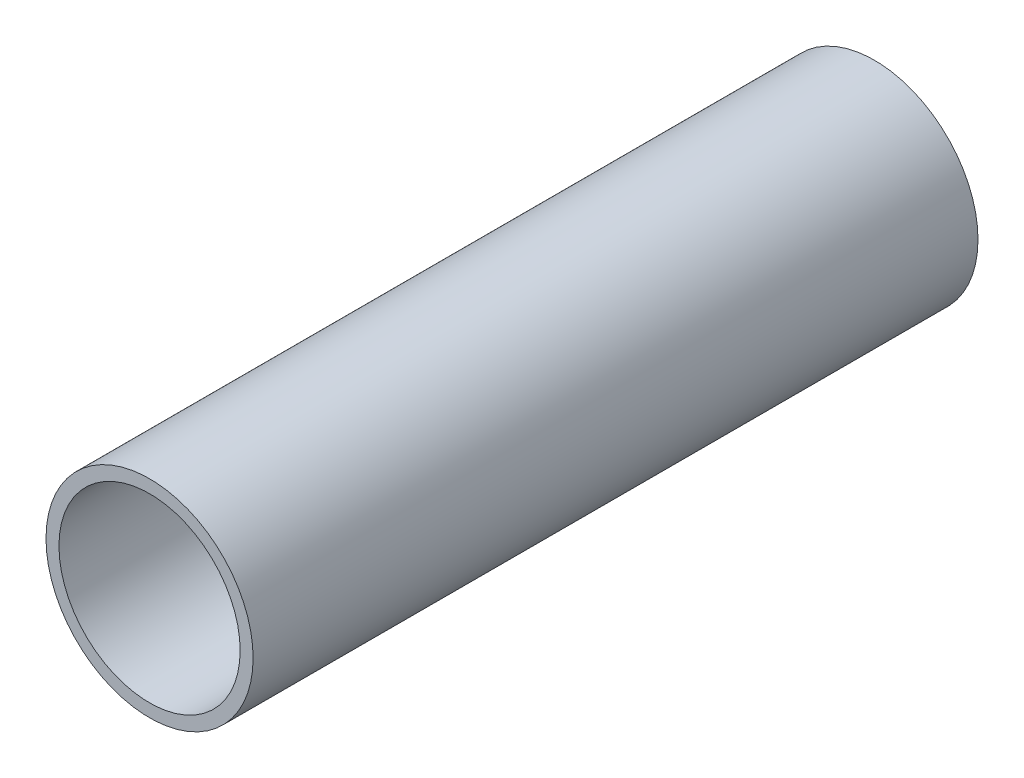
ISO-10303-21;
HEADER;
FILE_DESCRIPTION(('STEP AP214'),'2;1');
FILE_NAME('part.step','',(''),(''),'','','');
FILE_SCHEMA(('AUTOMOTIVE_DESIGN { 1 0 10303 214 1 1 1 1 }'));
ENDSEC;
DATA;
#1=APPLICATION_CONTEXT('core data for automotive mechanical design processes');
#2=APPLICATION_PROTOCOL_DEFINITION('international standard','automotive_design',2000,#1);
#3=PRODUCT_CONTEXT('',#1,'mechanical');
#4=PRODUCT('Part','Part','',(#3));
#5=PRODUCT_RELATED_PRODUCT_CATEGORY('part','',(#4));
#6=PRODUCT_DEFINITION_FORMATION('','',#4);
#7=PRODUCT_DEFINITION_CONTEXT('part definition',#1,'design');
#8=PRODUCT_DEFINITION('design','',#6,#7);
#9=PRODUCT_DEFINITION_SHAPE('','',#8);
#10=(LENGTH_UNIT() NAMED_UNIT(*) SI_UNIT(.MILLI.,.METRE.));
#11=(NAMED_UNIT(*) PLANE_ANGLE_UNIT() SI_UNIT($,.RADIAN.));
#12=(NAMED_UNIT(*) SI_UNIT($,.STERADIAN.) SOLID_ANGLE_UNIT());
#13=UNCERTAINTY_MEASURE_WITH_UNIT(LENGTH_MEASURE(1.E-05),#10,'distance_accuracy_value','');
#14=(GEOMETRIC_REPRESENTATION_CONTEXT(3) GLOBAL_UNCERTAINTY_ASSIGNED_CONTEXT((#13)) GLOBAL_UNIT_ASSIGNED_CONTEXT((#10,
#11,#12)) REPRESENTATION_CONTEXT('',''));
#15=CARTESIAN_POINT('',(0.,0.,0.));
#16=DIRECTION('',(0.,0.,1.));
#17=DIRECTION('',(1.,0.,0.));
#18=AXIS2_PLACEMENT_3D('',#15,#16,#17);
#19=CARTESIAN_POINT('',(0.,0.,177.8));
#20=DIRECTION('',(0.,0.,1.));
#21=DIRECTION('',(1.,0.,0.));
#22=AXIS2_PLACEMENT_3D('',#19,#20,#21);
#23=PLANE('',#22);
#24=CARTESIAN_POINT('',(0.,0.,177.8));
#25=DIRECTION('',(0.,0.,1.));
#26=DIRECTION('',(1.,0.,0.));
#27=AXIS2_PLACEMENT_3D('',#24,#25,#26);
#28=CIRCLE('',#27,50.8);
#29=CARTESIAN_POINT('',(50.8,0.,177.8));
#30=VERTEX_POINT('',#29);
#31=EDGE_CURVE('E10',#30,#30,#28,.T.);
#32=ORIENTED_EDGE('',*,*,#31,.T.);
#33=EDGE_LOOP('',(#32));
#34=FACE_BOUND('',#33,.T.);
#35=CARTESIAN_POINT('',(0.,0.,177.8));
#36=DIRECTION('',(0.,0.,1.));
#37=DIRECTION('',(1.,0.,0.));
#38=AXIS2_PLACEMENT_3D('',#35,#36,#37);
#39=CIRCLE('',#38,44.45);
#40=CARTESIAN_POINT('',(44.45,0.,177.8));
#41=VERTEX_POINT('',#40);
#42=EDGE_CURVE('E54',#41,#41,#39,.T.);
#43=ORIENTED_EDGE('',*,*,#42,.F.);
#44=EDGE_LOOP('',(#43));
#45=FACE_BOUND('',#44,.T.);
#46=ADVANCED_FACE('F41',(#34,#45),#23,.T.);
#47=CARTESIAN_POINT('',(0.,0.,-177.8));
#48=DIRECTION('',(0.,0.,1.));
#49=DIRECTION('',(1.,0.,0.));
#50=AXIS2_PLACEMENT_3D('',#47,#48,#49);
#51=PLANE('',#50);
#52=CARTESIAN_POINT('',(0.,0.,-177.8));
#53=DIRECTION('',(0.,0.,1.));
#54=DIRECTION('',(1.,0.,0.));
#55=AXIS2_PLACEMENT_3D('',#52,#53,#54);
#56=CIRCLE('',#55,50.8);
#57=CARTESIAN_POINT('',(50.8,0.,-177.8));
#58=VERTEX_POINT('',#57);
#59=EDGE_CURVE('E45',#58,#58,#56,.T.);
#60=ORIENTED_EDGE('',*,*,#59,.F.);
#61=EDGE_LOOP('',(#60));
#62=FACE_BOUND('',#61,.T.);
#63=CARTESIAN_POINT('',(0.,0.,-177.8));
#64=DIRECTION('',(0.,0.,1.));
#65=DIRECTION('',(1.,0.,0.));
#66=AXIS2_PLACEMENT_3D('',#63,#64,#65);
#67=CIRCLE('',#66,44.45);
#68=CARTESIAN_POINT('',(44.45,0.,-177.8));
#69=VERTEX_POINT('',#68);
#70=EDGE_CURVE('E56',#69,#69,#67,.T.);
#71=ORIENTED_EDGE('',*,*,#70,.T.);
#72=EDGE_LOOP('',(#71));
#73=FACE_BOUND('',#72,.T.);
#74=ADVANCED_FACE('F68',(#62,#73),#51,.F.);
#75=CARTESIAN_POINT('',(0.,0.,177.8));
#76=DIRECTION('',(0.,0.,-1.));
#77=DIRECTION('',(-1.,0.,0.));
#78=AXIS2_PLACEMENT_3D('',#75,#76,#77);
#79=CYLINDRICAL_SURFACE('',#78,50.8);
#80=ORIENTED_EDGE('',*,*,#31,.F.);
#81=EDGE_LOOP('',(#80));
#82=FACE_BOUND('',#81,.T.);
#83=ORIENTED_EDGE('',*,*,#59,.T.);
#84=EDGE_LOOP('',(#83));
#85=FACE_BOUND('',#84,.T.);
#86=ADVANCED_FACE('F43',(#82,#85),#79,.T.);
#87=CARTESIAN_POINT('',(0.,0.,177.8));
#88=DIRECTION('',(0.,0.,-1.));
#89=DIRECTION('',(-1.,0.,0.));
#90=AXIS2_PLACEMENT_3D('',#87,#88,#89);
#91=CYLINDRICAL_SURFACE('',#90,44.45);
#92=ORIENTED_EDGE('',*,*,#42,.T.);
#93=EDGE_LOOP('',(#92));
#94=FACE_BOUND('',#93,.T.);
#95=ORIENTED_EDGE('',*,*,#70,.F.);
#96=EDGE_LOOP('',(#95));
#97=FACE_BOUND('',#96,.T.);
#98=ADVANCED_FACE('F64',(#94,#97),#91,.F.);
#99=CLOSED_SHELL('',(#46,#74,#86,#98));
#100=MANIFOLD_SOLID_BREP('B2',#99);
#101=ADVANCED_BREP_SHAPE_REPRESENTATION('',(#18,#100),#14);
#102=SHAPE_DEFINITION_REPRESENTATION(#9,#101);
ENDSEC;
END-ISO-10303-21;
